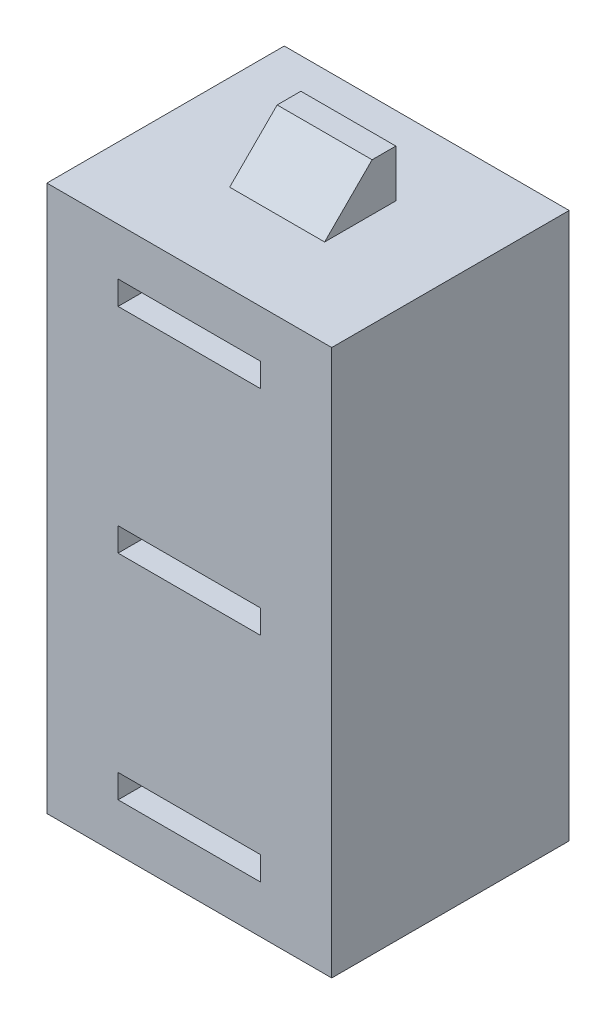
ISO-10303-21;
HEADER;
FILE_DESCRIPTION(('STEP AP214'),'2;1');
FILE_NAME('part.step','',(''),(''),'','','');
FILE_SCHEMA(('AUTOMOTIVE_DESIGN { 1 0 10303 214 1 1 1 1 }'));
ENDSEC;
DATA;
#1=APPLICATION_CONTEXT('core data for automotive mechanical design processes');
#2=APPLICATION_PROTOCOL_DEFINITION('international standard','automotive_design',2000,#1);
#3=PRODUCT_CONTEXT('',#1,'mechanical');
#4=PRODUCT('Part','Part','',(#3));
#5=PRODUCT_RELATED_PRODUCT_CATEGORY('part','',(#4));
#6=PRODUCT_DEFINITION_FORMATION('','',#4);
#7=PRODUCT_DEFINITION_CONTEXT('part definition',#1,'design');
#8=PRODUCT_DEFINITION('design','',#6,#7);
#9=PRODUCT_DEFINITION_SHAPE('','',#8);
#10=(LENGTH_UNIT() NAMED_UNIT(*) SI_UNIT(.MILLI.,.METRE.));
#11=(NAMED_UNIT(*) PLANE_ANGLE_UNIT() SI_UNIT($,.RADIAN.));
#12=(NAMED_UNIT(*) SI_UNIT($,.STERADIAN.) SOLID_ANGLE_UNIT());
#13=UNCERTAINTY_MEASURE_WITH_UNIT(LENGTH_MEASURE(1.E-05),#10,'distance_accuracy_value','');
#14=(GEOMETRIC_REPRESENTATION_CONTEXT(3) GLOBAL_UNCERTAINTY_ASSIGNED_CONTEXT((#13)) GLOBAL_UNIT_ASSIGNED_CONTEXT((#10,
#11,#12)) REPRESENTATION_CONTEXT('',''));
#15=CARTESIAN_POINT('',(0.,0.,0.));
#16=DIRECTION('',(0.,0.,1.));
#17=DIRECTION('',(1.,0.,0.));
#18=AXIS2_PLACEMENT_3D('',#15,#16,#17);
#19=CARTESIAN_POINT('',(0.,0.,-20.5));
#20=DIRECTION('',(0.,0.,1.));
#21=DIRECTION('',(1.,0.,0.));
#22=AXIS2_PLACEMENT_3D('',#19,#20,#21);
#23=PLANE('',#22);
#24=DIRECTION('',(0.,1.,0.));
#25=VECTOR('',#24,1.);
#26=CARTESIAN_POINT('',(-1.5,2.375,-20.5));
#27=LINE('',#26,#25);
#28=CARTESIAN_POINT('',(-1.5,4.25,-20.5));
#29=VERTEX_POINT('',#28);
#30=CARTESIAN_POINT('',(-1.5,4.75,-20.5));
#31=VERTEX_POINT('',#30);
#32=EDGE_CURVE('E284',#29,#31,#27,.T.);
#33=ORIENTED_EDGE('',*,*,#32,.T.);
#34=DIRECTION('',(1.,0.,0.));
#35=VECTOR('',#34,1.);
#36=CARTESIAN_POINT('',(0.74999999999999,4.75,-20.5));
#37=LINE('',#36,#35);
#38=CARTESIAN_POINT('',(1.5,4.75,-20.5));
#39=VERTEX_POINT('',#38);
#40=EDGE_CURVE('E416',#31,#39,#37,.T.);
#41=ORIENTED_EDGE('',*,*,#40,.T.);
#42=DIRECTION('',(0.,-1.,0.));
#43=VECTOR('',#42,1.);
#44=CARTESIAN_POINT('',(1.5,2.125,-20.5));
#45=LINE('',#44,#43);
#46=CARTESIAN_POINT('',(1.5,4.25,-20.5));
#47=VERTEX_POINT('',#46);
#48=EDGE_CURVE('E382',#39,#47,#45,.T.);
#49=ORIENTED_EDGE('',*,*,#48,.T.);
#50=DIRECTION('',(-1.,0.,0.));
#51=VECTOR('',#50,1.);
#52=CARTESIAN_POINT('',(-0.750000000000011,4.25,-20.5));
#53=LINE('',#52,#51);
#54=EDGE_CURVE('E327',#47,#29,#53,.T.);
#55=ORIENTED_EDGE('',*,*,#54,.T.);
#56=EDGE_LOOP('',(#33,#41,#49,#55));
#57=FACE_BOUND('',#56,.T.);
#58=DIRECTION('',(0.,1.,0.));
#59=VECTOR('',#58,1.);
#60=CARTESIAN_POINT('',(-1.5,0.125,-20.5));
#61=LINE('',#60,#59);
#62=CARTESIAN_POINT('',(-1.5,-0.25,-20.5));
#63=VERTEX_POINT('',#62);
#64=CARTESIAN_POINT('',(-1.5,0.25,-20.5));
#65=VERTEX_POINT('',#64);
#66=EDGE_CURVE('E348',#63,#65,#61,.T.);
#67=ORIENTED_EDGE('',*,*,#66,.T.);
#68=DIRECTION('',(1.,0.,0.));
#69=VECTOR('',#68,1.);
#70=CARTESIAN_POINT('',(0.74999999999999,0.25,-20.5));
#71=LINE('',#70,#69);
#72=CARTESIAN_POINT('',(1.5,0.25,-20.5));
#73=VERTEX_POINT('',#72);
#74=EDGE_CURVE('E264',#65,#73,#71,.T.);
#75=ORIENTED_EDGE('',*,*,#74,.T.);
#76=DIRECTION('',(0.,-1.,0.));
#77=VECTOR('',#76,1.);
#78=CARTESIAN_POINT('',(1.5,-0.125,-20.5));
#79=LINE('',#78,#77);
#80=CARTESIAN_POINT('',(1.5,-0.25,-20.5));
#81=VERTEX_POINT('',#80);
#82=EDGE_CURVE('E276',#73,#81,#79,.T.);
#83=ORIENTED_EDGE('',*,*,#82,.T.);
#84=DIRECTION('',(-1.,0.,0.));
#85=VECTOR('',#84,1.);
#86=CARTESIAN_POINT('',(-0.750000000000011,-0.25,-20.5));
#87=LINE('',#86,#85);
#88=EDGE_CURVE('E336',#81,#63,#87,.T.);
#89=ORIENTED_EDGE('',*,*,#88,.T.);
#90=EDGE_LOOP('',(#67,#75,#83,#89));
#91=FACE_BOUND('',#90,.T.);
#92=DIRECTION('',(0.,1.,0.));
#93=VECTOR('',#92,1.);
#94=CARTESIAN_POINT('',(-1.5,-2.125,-20.5));
#95=LINE('',#94,#93);
#96=CARTESIAN_POINT('',(-1.5,-4.75,-20.5));
#97=VERTEX_POINT('',#96);
#98=CARTESIAN_POINT('',(-1.5,-4.25,-20.5));
#99=VERTEX_POINT('',#98);
#100=EDGE_CURVE('E326',#97,#99,#95,.T.);
#101=ORIENTED_EDGE('',*,*,#100,.T.);
#102=DIRECTION('',(1.,0.,0.));
#103=VECTOR('',#102,1.);
#104=CARTESIAN_POINT('',(0.74999999999999,-4.25,-20.5));
#105=LINE('',#104,#103);
#106=CARTESIAN_POINT('',(1.5,-4.25,-20.5));
#107=VERTEX_POINT('',#106);
#108=EDGE_CURVE('E266',#99,#107,#105,.T.);
#109=ORIENTED_EDGE('',*,*,#108,.T.);
#110=DIRECTION('',(0.,-1.,0.));
#111=VECTOR('',#110,1.);
#112=CARTESIAN_POINT('',(1.5,-2.375,-20.5));
#113=LINE('',#112,#111);
#114=CARTESIAN_POINT('',(1.5,-4.75,-20.5));
#115=VERTEX_POINT('',#114);
#116=EDGE_CURVE('E401',#107,#115,#113,.T.);
#117=ORIENTED_EDGE('',*,*,#116,.T.);
#118=DIRECTION('',(-1.,0.,0.));
#119=VECTOR('',#118,1.);
#120=CARTESIAN_POINT('',(-0.750000000000011,-4.75,-20.5));
#121=LINE('',#120,#119);
#122=EDGE_CURVE('E292',#115,#97,#121,.T.);
#123=ORIENTED_EDGE('',*,*,#122,.T.);
#124=EDGE_LOOP('',(#101,#109,#117,#123));
#125=FACE_BOUND('',#124,.T.);
#126=DIRECTION('',(-1.,0.,0.));
#127=VECTOR('',#126,1.);
#128=CARTESIAN_POINT('',(3.,5.75,-20.5));
#129=LINE('',#128,#127);
#130=CARTESIAN_POINT('',(3.,5.75,-20.5));
#131=VERTEX_POINT('',#130);
#132=CARTESIAN_POINT('',(-3.,5.75,-20.5));
#133=VERTEX_POINT('',#132);
#134=EDGE_CURVE('E11',#131,#133,#129,.T.);
#135=ORIENTED_EDGE('',*,*,#134,.T.);
#136=DIRECTION('',(0.,-1.,0.));
#137=VECTOR('',#136,1.);
#138=CARTESIAN_POINT('',(-3.,5.75,-20.5));
#139=LINE('',#138,#137);
#140=CARTESIAN_POINT('',(-3.,-5.75,-20.5));
#141=VERTEX_POINT('',#140);
#142=EDGE_CURVE('E198',#133,#141,#139,.T.);
#143=ORIENTED_EDGE('',*,*,#142,.T.);
#144=DIRECTION('',(1.,0.,0.));
#145=VECTOR('',#144,1.);
#146=CARTESIAN_POINT('',(-3.,-5.75,-20.5));
#147=LINE('',#146,#145);
#148=CARTESIAN_POINT('',(3.,-5.75,-20.5));
#149=VERTEX_POINT('',#148);
#150=EDGE_CURVE('E192',#141,#149,#147,.T.);
#151=ORIENTED_EDGE('',*,*,#150,.T.);
#152=DIRECTION('',(0.,1.,0.));
#153=VECTOR('',#152,1.);
#154=CARTESIAN_POINT('',(3.,-5.75,-20.5));
#155=LINE('',#154,#153);
#156=EDGE_CURVE('E195',#149,#131,#155,.T.);
#157=ORIENTED_EDGE('',*,*,#156,.T.);
#158=EDGE_LOOP('',(#135,#143,#151,#157));
#159=FACE_BOUND('',#158,.T.);
#160=ADVANCED_FACE('F17',(#57,#91,#125,#159),#23,.T.);
#161=CARTESIAN_POINT('',(0.,0.,-25.5));
#162=DIRECTION('',(0.,0.,-1.));
#163=DIRECTION('',(-1.,0.,0.));
#164=AXIS2_PLACEMENT_3D('',#161,#162,#163);
#165=PLANE('',#164);
#166=DIRECTION('',(0.,-1.,0.));
#167=VECTOR('',#166,1.);
#168=CARTESIAN_POINT('',(-1.5,2.375,-25.5));
#169=LINE('',#168,#167);
#170=CARTESIAN_POINT('',(-1.5,4.75,-25.5));
#171=VERTEX_POINT('',#170);
#172=CARTESIAN_POINT('',(-1.5,4.25,-25.5));
#173=VERTEX_POINT('',#172);
#174=EDGE_CURVE('E288',#171,#173,#169,.T.);
#175=ORIENTED_EDGE('',*,*,#174,.T.);
#176=DIRECTION('',(1.,0.,0.));
#177=VECTOR('',#176,1.);
#178=CARTESIAN_POINT('',(-0.750000000000013,4.25,-25.5));
#179=LINE('',#178,#177);
#180=CARTESIAN_POINT('',(1.5,4.25,-25.5));
#181=VERTEX_POINT('',#180);
#182=EDGE_CURVE('E330',#173,#181,#179,.T.);
#183=ORIENTED_EDGE('',*,*,#182,.T.);
#184=DIRECTION('',(0.,1.,0.));
#185=VECTOR('',#184,1.);
#186=CARTESIAN_POINT('',(1.5,2.125,-25.5));
#187=LINE('',#186,#185);
#188=CARTESIAN_POINT('',(1.5,4.75,-25.5));
#189=VERTEX_POINT('',#188);
#190=EDGE_CURVE('E381',#181,#189,#187,.T.);
#191=ORIENTED_EDGE('',*,*,#190,.T.);
#192=DIRECTION('',(-1.,0.,0.));
#193=VECTOR('',#192,1.);
#194=CARTESIAN_POINT('',(0.749999999999988,4.75,-25.5));
#195=LINE('',#194,#193);
#196=EDGE_CURVE('E413',#189,#171,#195,.T.);
#197=ORIENTED_EDGE('',*,*,#196,.T.);
#198=EDGE_LOOP('',(#175,#183,#191,#197));
#199=FACE_BOUND('',#198,.T.);
#200=DIRECTION('',(0.,-1.,0.));
#201=VECTOR('',#200,1.);
#202=CARTESIAN_POINT('',(-1.5,0.125,-25.5));
#203=LINE('',#202,#201);
#204=CARTESIAN_POINT('',(-1.5,0.25,-25.5));
#205=VERTEX_POINT('',#204);
#206=CARTESIAN_POINT('',(-1.5,-0.25,-25.5));
#207=VERTEX_POINT('',#206);
#208=EDGE_CURVE('E265',#205,#207,#203,.T.);
#209=ORIENTED_EDGE('',*,*,#208,.T.);
#210=DIRECTION('',(1.,0.,0.));
#211=VECTOR('',#210,1.);
#212=CARTESIAN_POINT('',(-0.750000000000013,-0.25,-25.5));
#213=LINE('',#212,#211);
#214=CARTESIAN_POINT('',(1.5,-0.25,-25.5));
#215=VERTEX_POINT('',#214);
#216=EDGE_CURVE('E409',#207,#215,#213,.T.);
#217=ORIENTED_EDGE('',*,*,#216,.T.);
#218=DIRECTION('',(0.,1.,0.));
#219=VECTOR('',#218,1.);
#220=CARTESIAN_POINT('',(1.5,-0.125,-25.5));
#221=LINE('',#220,#219);
#222=CARTESIAN_POINT('',(1.5,0.25,-25.5));
#223=VERTEX_POINT('',#222);
#224=EDGE_CURVE('E275',#215,#223,#221,.T.);
#225=ORIENTED_EDGE('',*,*,#224,.T.);
#226=DIRECTION('',(-1.,0.,0.));
#227=VECTOR('',#226,1.);
#228=CARTESIAN_POINT('',(0.749999999999988,0.25,-25.5));
#229=LINE('',#228,#227);
#230=EDGE_CURVE('E306',#223,#205,#229,.T.);
#231=ORIENTED_EDGE('',*,*,#230,.T.);
#232=EDGE_LOOP('',(#209,#217,#225,#231));
#233=FACE_BOUND('',#232,.T.);
#234=DIRECTION('',(0.,-1.,0.));
#235=VECTOR('',#234,1.);
#236=CARTESIAN_POINT('',(-1.5,-2.125,-25.5));
#237=LINE('',#236,#235);
#238=CARTESIAN_POINT('',(-1.5,-4.25,-25.5));
#239=VERTEX_POINT('',#238);
#240=CARTESIAN_POINT('',(-1.5,-4.75,-25.5));
#241=VERTEX_POINT('',#240);
#242=EDGE_CURVE('E322',#239,#241,#237,.T.);
#243=ORIENTED_EDGE('',*,*,#242,.T.);
#244=DIRECTION('',(1.,0.,0.));
#245=VECTOR('',#244,1.);
#246=CARTESIAN_POINT('',(-0.750000000000013,-4.75,-25.5));
#247=LINE('',#246,#245);
#248=CARTESIAN_POINT('',(1.5,-4.75,-25.5));
#249=VERTEX_POINT('',#248);
#250=EDGE_CURVE('E296',#241,#249,#247,.T.);
#251=ORIENTED_EDGE('',*,*,#250,.T.);
#252=DIRECTION('',(0.,1.,0.));
#253=VECTOR('',#252,1.);
#254=CARTESIAN_POINT('',(1.5,-2.375,-25.5));
#255=LINE('',#254,#253);
#256=CARTESIAN_POINT('',(1.5,-4.25,-25.5));
#257=VERTEX_POINT('',#256);
#258=EDGE_CURVE('E310',#249,#257,#255,.T.);
#259=ORIENTED_EDGE('',*,*,#258,.T.);
#260=DIRECTION('',(-1.,0.,0.));
#261=VECTOR('',#260,1.);
#262=CARTESIAN_POINT('',(0.749999999999987,-4.25,-25.5));
#263=LINE('',#262,#261);
#264=EDGE_CURVE('E269',#257,#239,#263,.T.);
#265=ORIENTED_EDGE('',*,*,#264,.T.);
#266=EDGE_LOOP('',(#243,#251,#259,#265));
#267=FACE_BOUND('',#266,.T.);
#268=DIRECTION('',(-1.,0.,0.));
#269=VECTOR('',#268,1.);
#270=CARTESIAN_POINT('',(3.,5.75,-25.5));
#271=LINE('',#270,#269);
#272=CARTESIAN_POINT('',(3.,5.75,-25.5));
#273=VERTEX_POINT('',#272);
#274=CARTESIAN_POINT('',(-3.,5.75,-25.5));
#275=VERTEX_POINT('',#274);
#276=EDGE_CURVE('E28',#273,#275,#271,.T.);
#277=ORIENTED_EDGE('',*,*,#276,.F.);
#278=DIRECTION('',(0.,1.,0.));
#279=VECTOR('',#278,1.);
#280=CARTESIAN_POINT('',(3.,-5.75,-25.5));
#281=LINE('',#280,#279);
#282=CARTESIAN_POINT('',(3.,-5.75,-25.5));
#283=VERTEX_POINT('',#282);
#284=EDGE_CURVE('E224',#283,#273,#281,.T.);
#285=ORIENTED_EDGE('',*,*,#284,.F.);
#286=DIRECTION('',(1.,0.,0.));
#287=VECTOR('',#286,1.);
#288=CARTESIAN_POINT('',(-3.,-5.75,-25.5));
#289=LINE('',#288,#287);
#290=CARTESIAN_POINT('',(-3.,-5.75,-25.5));
#291=VERTEX_POINT('',#290);
#292=EDGE_CURVE('E204',#291,#283,#289,.T.);
#293=ORIENTED_EDGE('',*,*,#292,.F.);
#294=DIRECTION('',(0.,-1.,0.));
#295=VECTOR('',#294,1.);
#296=CARTESIAN_POINT('',(-3.,5.75,-25.5));
#297=LINE('',#296,#295);
#298=EDGE_CURVE('E279',#275,#291,#297,.T.);
#299=ORIENTED_EDGE('',*,*,#298,.F.);
#300=EDGE_LOOP('',(#277,#285,#293,#299));
#301=FACE_BOUND('',#300,.T.);
#302=ADVANCED_FACE('F496',(#199,#233,#267,#301),#165,.T.);
#303=CARTESIAN_POINT('',(3.,5.75,-25.5));
#304=DIRECTION('',(0.,1.,0.));
#305=DIRECTION('',(1.,0.,0.));
#306=AXIS2_PLACEMENT_3D('',#303,#304,#305);
#307=PLANE('',#306);
#308=DIRECTION('',(0.,0.,-1.));
#309=VECTOR('',#308,1.);
#310=CARTESIAN_POINT('',(-1.,5.75,-24.3));
#311=LINE('',#310,#309);
#312=CARTESIAN_POINT('',(-1.,5.75,-22.35));
#313=VERTEX_POINT('',#312);
#314=CARTESIAN_POINT('',(-1.,5.75,-23.85));
#315=VERTEX_POINT('',#314);
#316=EDGE_CURVE('E464',#313,#315,#311,.T.);
#317=ORIENTED_EDGE('',*,*,#316,.T.);
#318=DIRECTION('',(1.,0.,0.));
#319=VECTOR('',#318,1.);
#320=CARTESIAN_POINT('',(1.5,5.75,-23.85));
#321=LINE('',#320,#319);
#322=CARTESIAN_POINT('',(1.,5.75,-23.85));
#323=VERTEX_POINT('',#322);
#324=EDGE_CURVE('E352',#315,#323,#321,.T.);
#325=ORIENTED_EDGE('',*,*,#324,.T.);
#326=DIRECTION('',(0.,0.,1.));
#327=VECTOR('',#326,1.);
#328=CARTESIAN_POINT('',(1.,5.75,-24.3));
#329=LINE('',#328,#327);
#330=CARTESIAN_POINT('',(1.,5.75,-22.35));
#331=VERTEX_POINT('',#330);
#332=EDGE_CURVE('E355',#323,#331,#329,.T.);
#333=ORIENTED_EDGE('',*,*,#332,.T.);
#334=DIRECTION('',(-1.,0.,0.));
#335=VECTOR('',#334,1.);
#336=CARTESIAN_POINT('',(1.5,5.75,-22.35));
#337=LINE('',#336,#335);
#338=EDGE_CURVE('E232',#331,#313,#337,.T.);
#339=ORIENTED_EDGE('',*,*,#338,.T.);
#340=EDGE_LOOP('',(#317,#325,#333,#339));
#341=FACE_BOUND('',#340,.T.);
#342=ORIENTED_EDGE('',*,*,#276,.T.);
#343=DIRECTION('',(0.,0.,1.));
#344=VECTOR('',#343,1.);
#345=CARTESIAN_POINT('',(-3.,5.75,-25.5));
#346=LINE('',#345,#344);
#347=EDGE_CURVE('E231',#275,#133,#346,.T.);
#348=ORIENTED_EDGE('',*,*,#347,.T.);
#349=ORIENTED_EDGE('',*,*,#134,.F.);
#350=DIRECTION('',(0.,0.,1.));
#351=VECTOR('',#350,1.);
#352=CARTESIAN_POINT('',(3.,5.75,-25.5));
#353=LINE('',#352,#351);
#354=EDGE_CURVE('E217',#273,#131,#353,.T.);
#355=ORIENTED_EDGE('',*,*,#354,.F.);
#356=EDGE_LOOP('',(#342,#348,#349,#355));
#357=FACE_BOUND('',#356,.T.);
#358=ADVANCED_FACE('F520',(#341,#357),#307,.T.);
#359=CARTESIAN_POINT('',(-3.,5.75,-25.5));
#360=DIRECTION('',(-1.,0.,0.));
#361=DIRECTION('',(0.,1.,0.));
#362=AXIS2_PLACEMENT_3D('',#359,#360,#361);
#363=PLANE('',#362);
#364=ORIENTED_EDGE('',*,*,#298,.T.);
#365=DIRECTION('',(0.,0.,1.));
#366=VECTOR('',#365,1.);
#367=CARTESIAN_POINT('',(-3.,-5.75,-25.5));
#368=LINE('',#367,#366);
#369=EDGE_CURVE('E203',#291,#141,#368,.T.);
#370=ORIENTED_EDGE('',*,*,#369,.T.);
#371=ORIENTED_EDGE('',*,*,#142,.F.);
#372=ORIENTED_EDGE('',*,*,#347,.F.);
#373=EDGE_LOOP('',(#364,#370,#371,#372));
#374=FACE_BOUND('',#373,.T.);
#375=ADVANCED_FACE('F923',(#374),#363,.T.);
#376=CARTESIAN_POINT('',(-3.,-5.75,-25.5));
#377=DIRECTION('',(0.,-1.,0.));
#378=DIRECTION('',(0.,0.,-1.));
#379=AXIS2_PLACEMENT_3D('',#376,#377,#378);
#380=PLANE('',#379);
#381=DIRECTION('',(0.,0.,1.));
#382=VECTOR('',#381,1.);
#383=CARTESIAN_POINT('',(-1.,-5.75,-24.3));
#384=LINE('',#383,#382);
#385=CARTESIAN_POINT('',(-1.,-5.75,-23.85));
#386=VERTEX_POINT('',#385);
#387=CARTESIAN_POINT('',(-1.,-5.75,-22.35));
#388=VERTEX_POINT('',#387);
#389=EDGE_CURVE('E387',#386,#388,#384,.T.);
#390=ORIENTED_EDGE('',*,*,#389,.T.);
#391=DIRECTION('',(1.,0.,0.));
#392=VECTOR('',#391,1.);
#393=CARTESIAN_POINT('',(-1.5,-5.75,-22.35));
#394=LINE('',#393,#392);
#395=CARTESIAN_POINT('',(1.,-5.75,-22.35));
#396=VERTEX_POINT('',#395);
#397=EDGE_CURVE('E315',#388,#396,#394,.T.);
#398=ORIENTED_EDGE('',*,*,#397,.T.);
#399=DIRECTION('',(0.,0.,-1.));
#400=VECTOR('',#399,1.);
#401=CARTESIAN_POINT('',(1.,-5.75,-24.3));
#402=LINE('',#401,#400);
#403=CARTESIAN_POINT('',(1.,-5.75,-23.85));
#404=VERTEX_POINT('',#403);
#405=EDGE_CURVE('E280',#396,#404,#402,.T.);
#406=ORIENTED_EDGE('',*,*,#405,.T.);
#407=DIRECTION('',(-1.,0.,0.));
#408=VECTOR('',#407,1.);
#409=CARTESIAN_POINT('',(-1.5,-5.75,-23.85));
#410=LINE('',#409,#408);
#411=EDGE_CURVE('E342',#404,#386,#410,.T.);
#412=ORIENTED_EDGE('',*,*,#411,.T.);
#413=EDGE_LOOP('',(#390,#398,#406,#412));
#414=FACE_BOUND('',#413,.T.);
#415=ORIENTED_EDGE('',*,*,#292,.T.);
#416=DIRECTION('',(0.,0.,1.));
#417=VECTOR('',#416,1.);
#418=CARTESIAN_POINT('',(3.,-5.75,-25.5));
#419=LINE('',#418,#417);
#420=EDGE_CURVE('E208',#283,#149,#419,.T.);
#421=ORIENTED_EDGE('',*,*,#420,.T.);
#422=ORIENTED_EDGE('',*,*,#150,.F.);
#423=ORIENTED_EDGE('',*,*,#369,.F.);
#424=EDGE_LOOP('',(#415,#421,#422,#423));
#425=FACE_BOUND('',#424,.T.);
#426=ADVANCED_FACE('F19',(#414,#425),#380,.T.);
#427=CARTESIAN_POINT('',(3.,-5.75,-25.5));
#428=DIRECTION('',(1.,0.,0.));
#429=DIRECTION('',(0.,0.,-1.));
#430=AXIS2_PLACEMENT_3D('',#427,#428,#429);
#431=PLANE('',#430);
#432=ORIENTED_EDGE('',*,*,#284,.T.);
#433=ORIENTED_EDGE('',*,*,#354,.T.);
#434=ORIENTED_EDGE('',*,*,#156,.F.);
#435=ORIENTED_EDGE('',*,*,#420,.F.);
#436=EDGE_LOOP('',(#432,#433,#434,#435));
#437=FACE_BOUND('',#436,.T.);
#438=ADVANCED_FACE('F215',(#437),#431,.T.);
#439=CARTESIAN_POINT('',(1.,-6.25,-23.1));
#440=DIRECTION('',(1.,0.,0.));
#441=DIRECTION('',(0.,1.,0.));
#442=AXIS2_PLACEMENT_3D('',#439,#440,#441);
#443=PLANE('',#442);
#444=DIRECTION('',(0.,0.707106781186549,0.707106781186546));
#445=VECTOR('',#444,1.);
#446=CARTESIAN_POINT('',(1.,-6.3125,-22.9125));
#447=LINE('',#446,#445);
#448=CARTESIAN_POINT('',(1.,-6.75,-23.35));
#449=VERTEX_POINT('',#448);
#450=EDGE_CURVE('E319',#449,#396,#447,.T.);
#451=ORIENTED_EDGE('',*,*,#450,.F.);
#452=DIRECTION('',(0.,0.,-1.));
#453=VECTOR('',#452,1.);
#454=CARTESIAN_POINT('',(1.,-6.75,-23.85));
#455=LINE('',#454,#453);
#456=CARTESIAN_POINT('',(1.,-6.75,-23.85));
#457=VERTEX_POINT('',#456);
#458=EDGE_CURVE('E383',#449,#457,#455,.T.);
#459=ORIENTED_EDGE('',*,*,#458,.T.);
#460=DIRECTION('',(0.,1.,0.));
#461=VECTOR('',#460,1.);
#462=CARTESIAN_POINT('',(1.,-5.75,-23.85));
#463=LINE('',#462,#461);
#464=EDGE_CURVE('E283',#457,#404,#463,.T.);
#465=ORIENTED_EDGE('',*,*,#464,.T.);
#466=ORIENTED_EDGE('',*,*,#405,.F.);
#467=EDGE_LOOP('',(#451,#459,#465,#466));
#468=FACE_BOUND('',#467,.T.);
#469=ADVANCED_FACE('F543',(#468),#443,.T.);
#470=CARTESIAN_POINT('',(0.,-6.75,-23.85));
#471=DIRECTION('',(0.,0.,-1.));
#472=DIRECTION('',(0.,-1.,0.));
#473=AXIS2_PLACEMENT_3D('',#470,#471,#472);
#474=PLANE('',#473);
#475=ORIENTED_EDGE('',*,*,#411,.F.);
#476=ORIENTED_EDGE('',*,*,#464,.F.);
#477=DIRECTION('',(1.,0.,0.));
#478=VECTOR('',#477,1.);
#479=CARTESIAN_POINT('',(0.,-6.75,-23.85));
#480=LINE('',#479,#478);
#481=CARTESIAN_POINT('',(-1.,-6.75,-23.85));
#482=VERTEX_POINT('',#481);
#483=EDGE_CURVE('E388',#482,#457,#480,.T.);
#484=ORIENTED_EDGE('',*,*,#483,.F.);
#485=DIRECTION('',(0.,-1.,0.));
#486=VECTOR('',#485,1.);
#487=CARTESIAN_POINT('',(-1.,-5.75,-23.85));
#488=LINE('',#487,#486);
#489=EDGE_CURVE('E21',#386,#482,#488,.T.);
#490=ORIENTED_EDGE('',*,*,#489,.F.);
#491=EDGE_LOOP('',(#475,#476,#484,#490));
#492=FACE_BOUND('',#491,.T.);
#493=ADVANCED_FACE('F539',(#492),#474,.T.);
#494=CARTESIAN_POINT('',(1.,6.25,-23.1));
#495=DIRECTION('',(1.,0.,0.));
#496=DIRECTION('',(0.,1.,0.));
#497=AXIS2_PLACEMENT_3D('',#494,#495,#496);
#498=PLANE('',#497);
#499=DIRECTION('',(0.,0.707106781186548,-0.707106781186548));
#500=VECTOR('',#499,1.);
#501=CARTESIAN_POINT('',(1.,6.3125,-22.9125));
#502=LINE('',#501,#500);
#503=CARTESIAN_POINT('',(1.,6.75,-23.35));
#504=VERTEX_POINT('',#503);
#505=EDGE_CURVE('E255',#331,#504,#502,.T.);
#506=ORIENTED_EDGE('',*,*,#505,.F.);
#507=ORIENTED_EDGE('',*,*,#332,.F.);
#508=DIRECTION('',(0.,1.,0.));
#509=VECTOR('',#508,1.);
#510=CARTESIAN_POINT('',(1.,5.75,-23.85));
#511=LINE('',#510,#509);
#512=CARTESIAN_POINT('',(1.,6.75,-23.85));
#513=VERTEX_POINT('',#512);
#514=EDGE_CURVE('E356',#323,#513,#511,.T.);
#515=ORIENTED_EDGE('',*,*,#514,.T.);
#516=DIRECTION('',(0.,0.,1.));
#517=VECTOR('',#516,1.);
#518=CARTESIAN_POINT('',(1.,6.75,-23.85));
#519=LINE('',#518,#517);
#520=EDGE_CURVE('E372',#513,#504,#519,.T.);
#521=ORIENTED_EDGE('',*,*,#520,.T.);
#522=EDGE_LOOP('',(#506,#507,#515,#521));
#523=FACE_BOUND('',#522,.T.);
#524=ADVANCED_FACE('F535',(#523),#498,.T.);
#525=CARTESIAN_POINT('',(0.,5.75,-23.85));
#526=DIRECTION('',(0.,0.,-1.));
#527=DIRECTION('',(0.,-1.,0.));
#528=AXIS2_PLACEMENT_3D('',#525,#526,#527);
#529=PLANE('',#528);
#530=DIRECTION('',(1.,0.,0.));
#531=VECTOR('',#530,1.);
#532=CARTESIAN_POINT('',(0.,6.75,-23.85));
#533=LINE('',#532,#531);
#534=CARTESIAN_POINT('',(-1.,6.75,-23.85));
#535=VERTEX_POINT('',#534);
#536=EDGE_CURVE('E364',#535,#513,#533,.T.);
#537=ORIENTED_EDGE('',*,*,#536,.T.);
#538=ORIENTED_EDGE('',*,*,#514,.F.);
#539=ORIENTED_EDGE('',*,*,#324,.F.);
#540=DIRECTION('',(0.,-1.,0.));
#541=VECTOR('',#540,1.);
#542=CARTESIAN_POINT('',(-1.,5.75,-23.85));
#543=LINE('',#542,#541);
#544=EDGE_CURVE('E227',#535,#315,#543,.T.);
#545=ORIENTED_EDGE('',*,*,#544,.F.);
#546=EDGE_LOOP('',(#537,#538,#539,#545));
#547=FACE_BOUND('',#546,.T.);
#548=ADVANCED_FACE('F538',(#547),#529,.T.);
#549=CARTESIAN_POINT('',(0.,6.75,-23.85));
#550=DIRECTION('',(0.,1.,0.));
#551=DIRECTION('',(1.,0.,0.));
#552=AXIS2_PLACEMENT_3D('',#549,#550,#551);
#553=PLANE('',#552);
#554=DIRECTION('',(-1.,0.,0.));
#555=VECTOR('',#554,1.);
#556=CARTESIAN_POINT('',(0.,6.75,-23.35));
#557=LINE('',#556,#555);
#558=CARTESIAN_POINT('',(-1.,6.75,-23.35));
#559=VERTEX_POINT('',#558);
#560=EDGE_CURVE('E247',#504,#559,#557,.T.);
#561=ORIENTED_EDGE('',*,*,#560,.F.);
#562=ORIENTED_EDGE('',*,*,#520,.F.);
#563=ORIENTED_EDGE('',*,*,#536,.F.);
#564=DIRECTION('',(0.,0.,-1.));
#565=VECTOR('',#564,1.);
#566=CARTESIAN_POINT('',(-1.,6.75,-23.85));
#567=LINE('',#566,#565);
#568=EDGE_CURVE('E235',#559,#535,#567,.T.);
#569=ORIENTED_EDGE('',*,*,#568,.F.);
#570=EDGE_LOOP('',(#561,#562,#563,#569));
#571=FACE_BOUND('',#570,.T.);
#572=ADVANCED_FACE('F533',(#571),#553,.T.);
#573=CARTESIAN_POINT('',(-1.,-6.25,-23.1));
#574=DIRECTION('',(-1.,0.,0.));
#575=DIRECTION('',(0.,0.,1.));
#576=AXIS2_PLACEMENT_3D('',#573,#574,#575);
#577=PLANE('',#576);
#578=DIRECTION('',(0.,-0.707106781186549,-0.707106781186546));
#579=VECTOR('',#578,1.);
#580=CARTESIAN_POINT('',(-1.,-6.3125,-22.9125));
#581=LINE('',#580,#579);
#582=CARTESIAN_POINT('',(-1.,-6.75,-23.35));
#583=VERTEX_POINT('',#582);
#584=EDGE_CURVE('E303',#388,#583,#581,.T.);
#585=ORIENTED_EDGE('',*,*,#584,.F.);
#586=ORIENTED_EDGE('',*,*,#389,.F.);
#587=ORIENTED_EDGE('',*,*,#489,.T.);
#588=DIRECTION('',(0.,0.,1.));
#589=VECTOR('',#588,1.);
#590=CARTESIAN_POINT('',(-1.,-6.75,-23.85));
#591=LINE('',#590,#589);
#592=EDGE_CURVE('E302',#482,#583,#591,.T.);
#593=ORIENTED_EDGE('',*,*,#592,.T.);
#594=EDGE_LOOP('',(#585,#586,#587,#593));
#595=FACE_BOUND('',#594,.T.);
#596=ADVANCED_FACE('F529',(#595),#577,.T.);
#597=CARTESIAN_POINT('',(0.,-6.75,-22.35));
#598=DIRECTION('',(0.,-1.,0.));
#599=DIRECTION('',(0.,0.,-1.));
#600=AXIS2_PLACEMENT_3D('',#597,#598,#599);
#601=PLANE('',#600);
#602=DIRECTION('',(1.,0.,0.));
#603=VECTOR('',#602,1.);
#604=CARTESIAN_POINT('',(0.,-6.75,-23.35));
#605=LINE('',#604,#603);
#606=EDGE_CURVE('E298',#583,#449,#605,.T.);
#607=ORIENTED_EDGE('',*,*,#606,.F.);
#608=ORIENTED_EDGE('',*,*,#592,.F.);
#609=ORIENTED_EDGE('',*,*,#483,.T.);
#610=ORIENTED_EDGE('',*,*,#458,.F.);
#611=EDGE_LOOP('',(#607,#608,#609,#610));
#612=FACE_BOUND('',#611,.T.);
#613=ADVANCED_FACE('F532',(#612),#601,.T.);
#614=CARTESIAN_POINT('',(0.,-6.25,-22.85));
#615=DIRECTION('',(0.,-0.707106781186546,0.707106781186549));
#616=DIRECTION('',(-1.,0.,0.));
#617=AXIS2_PLACEMENT_3D('',#614,#615,#616);
#618=PLANE('',#617);
#619=ORIENTED_EDGE('',*,*,#450,.T.);
#620=ORIENTED_EDGE('',*,*,#397,.F.);
#621=ORIENTED_EDGE('',*,*,#584,.T.);
#622=ORIENTED_EDGE('',*,*,#606,.T.);
#623=EDGE_LOOP('',(#619,#620,#621,#622));
#624=FACE_BOUND('',#623,.T.);
#625=ADVANCED_FACE('F837',(#624),#618,.T.);
#626=CARTESIAN_POINT('',(-1.,6.25,-23.1));
#627=DIRECTION('',(-1.,0.,0.));
#628=DIRECTION('',(0.,0.,1.));
#629=AXIS2_PLACEMENT_3D('',#626,#627,#628);
#630=PLANE('',#629);
#631=DIRECTION('',(0.,-0.707106781186548,0.707106781186548));
#632=VECTOR('',#631,1.);
#633=CARTESIAN_POINT('',(-1.,6.3125,-22.9125));
#634=LINE('',#633,#632);
#635=EDGE_CURVE('E236',#559,#313,#634,.T.);
#636=ORIENTED_EDGE('',*,*,#635,.F.);
#637=ORIENTED_EDGE('',*,*,#568,.T.);
#638=ORIENTED_EDGE('',*,*,#544,.T.);
#639=ORIENTED_EDGE('',*,*,#316,.F.);
#640=EDGE_LOOP('',(#636,#637,#638,#639));
#641=FACE_BOUND('',#640,.T.);
#642=ADVANCED_FACE('F555',(#641),#630,.T.);
#643=CARTESIAN_POINT('',(0.,6.25,-22.85));
#644=DIRECTION('',(0.,0.707106781186548,0.707106781186548));
#645=DIRECTION('',(1.,0.,0.));
#646=AXIS2_PLACEMENT_3D('',#643,#644,#645);
#647=PLANE('',#646);
#648=ORIENTED_EDGE('',*,*,#505,.T.);
#649=ORIENTED_EDGE('',*,*,#560,.T.);
#650=ORIENTED_EDGE('',*,*,#635,.T.);
#651=ORIENTED_EDGE('',*,*,#338,.F.);
#652=EDGE_LOOP('',(#648,#649,#650,#651));
#653=FACE_BOUND('',#652,.T.);
#654=ADVANCED_FACE('F550',(#653),#647,.T.);
#655=CARTESIAN_POINT('',(1.5,4.75,-25.5));
#656=DIRECTION('',(0.,1.,0.));
#657=DIRECTION('',(1.,0.,0.));
#658=AXIS2_PLACEMENT_3D('',#655,#656,#657);
#659=PLANE('',#658);
#660=ORIENTED_EDGE('',*,*,#40,.F.);
#661=DIRECTION('',(0.,0.,1.));
#662=VECTOR('',#661,1.);
#663=CARTESIAN_POINT('',(-1.5,4.75,-25.5));
#664=LINE('',#663,#662);
#665=EDGE_CURVE('E427',#171,#31,#664,.T.);
#666=ORIENTED_EDGE('',*,*,#665,.F.);
#667=ORIENTED_EDGE('',*,*,#196,.F.);
#668=DIRECTION('',(0.,0.,1.));
#669=VECTOR('',#668,1.);
#670=CARTESIAN_POINT('',(1.5,4.75,-25.5));
#671=LINE('',#670,#669);
#672=EDGE_CURVE('E377',#189,#39,#671,.T.);
#673=ORIENTED_EDGE('',*,*,#672,.T.);
#674=EDGE_LOOP('',(#660,#666,#667,#673));
#675=FACE_BOUND('',#674,.T.);
#676=ADVANCED_FACE('F498',(#675),#659,.F.);
#677=CARTESIAN_POINT('',(-1.5,4.75,-25.5));
#678=DIRECTION('',(-1.,0.,0.));
#679=DIRECTION('',(0.,1.,0.));
#680=AXIS2_PLACEMENT_3D('',#677,#678,#679);
#681=PLANE('',#680);
#682=ORIENTED_EDGE('',*,*,#32,.F.);
#683=DIRECTION('',(0.,0.,1.));
#684=VECTOR('',#683,1.);
#685=CARTESIAN_POINT('',(-1.5,4.25,-25.5));
#686=LINE('',#685,#684);
#687=EDGE_CURVE('E289',#173,#29,#686,.T.);
#688=ORIENTED_EDGE('',*,*,#687,.F.);
#689=ORIENTED_EDGE('',*,*,#174,.F.);
#690=ORIENTED_EDGE('',*,*,#665,.T.);
#691=EDGE_LOOP('',(#682,#688,#689,#690));
#692=FACE_BOUND('',#691,.T.);
#693=ADVANCED_FACE('F485',(#692),#681,.F.);
#694=CARTESIAN_POINT('',(-1.5,4.25,-25.5));
#695=DIRECTION('',(0.,-1.,0.));
#696=DIRECTION('',(0.,0.,-1.));
#697=AXIS2_PLACEMENT_3D('',#694,#695,#696);
#698=PLANE('',#697);
#699=ORIENTED_EDGE('',*,*,#54,.F.);
#700=DIRECTION('',(0.,0.,1.));
#701=VECTOR('',#700,1.);
#702=CARTESIAN_POINT('',(1.5,4.25,-25.5));
#703=LINE('',#702,#701);
#704=EDGE_CURVE('E331',#181,#47,#703,.T.);
#705=ORIENTED_EDGE('',*,*,#704,.F.);
#706=ORIENTED_EDGE('',*,*,#182,.F.);
#707=ORIENTED_EDGE('',*,*,#687,.T.);
#708=EDGE_LOOP('',(#699,#705,#706,#707));
#709=FACE_BOUND('',#708,.T.);
#710=ADVANCED_FACE('F494',(#709),#698,.F.);
#711=CARTESIAN_POINT('',(1.5,4.25,-25.5));
#712=DIRECTION('',(1.,0.,0.));
#713=DIRECTION('',(0.,0.,-1.));
#714=AXIS2_PLACEMENT_3D('',#711,#712,#713);
#715=PLANE('',#714);
#716=ORIENTED_EDGE('',*,*,#48,.F.);
#717=ORIENTED_EDGE('',*,*,#672,.F.);
#718=ORIENTED_EDGE('',*,*,#190,.F.);
#719=ORIENTED_EDGE('',*,*,#704,.T.);
#720=EDGE_LOOP('',(#716,#717,#718,#719));
#721=FACE_BOUND('',#720,.T.);
#722=ADVANCED_FACE('F501',(#721),#715,.F.);
#723=CARTESIAN_POINT('',(1.5,0.25,-25.5));
#724=DIRECTION('',(0.,1.,0.));
#725=DIRECTION('',(1.,0.,0.));
#726=AXIS2_PLACEMENT_3D('',#723,#724,#725);
#727=PLANE('',#726);
#728=ORIENTED_EDGE('',*,*,#74,.F.);
#729=DIRECTION('',(0.,0.,1.));
#730=VECTOR('',#729,1.);
#731=CARTESIAN_POINT('',(-1.5,0.25,-25.5));
#732=LINE('',#731,#730);
#733=EDGE_CURVE('E260',#205,#65,#732,.T.);
#734=ORIENTED_EDGE('',*,*,#733,.F.);
#735=ORIENTED_EDGE('',*,*,#230,.F.);
#736=DIRECTION('',(0.,0.,1.));
#737=VECTOR('',#736,1.);
#738=CARTESIAN_POINT('',(1.5,0.25,-25.5));
#739=LINE('',#738,#737);
#740=EDGE_CURVE('E271',#223,#73,#739,.T.);
#741=ORIENTED_EDGE('',*,*,#740,.T.);
#742=EDGE_LOOP('',(#728,#734,#735,#741));
#743=FACE_BOUND('',#742,.T.);
#744=ADVANCED_FACE('F503',(#743),#727,.F.);
#745=CARTESIAN_POINT('',(-1.5,0.25,-25.5));
#746=DIRECTION('',(-1.,0.,0.));
#747=DIRECTION('',(0.,1.,0.));
#748=AXIS2_PLACEMENT_3D('',#745,#746,#747);
#749=PLANE('',#748);
#750=ORIENTED_EDGE('',*,*,#66,.F.);
#751=DIRECTION('',(0.,0.,1.));
#752=VECTOR('',#751,1.);
#753=CARTESIAN_POINT('',(-1.5,-0.25,-25.5));
#754=LINE('',#753,#752);
#755=EDGE_CURVE('E351',#207,#63,#754,.T.);
#756=ORIENTED_EDGE('',*,*,#755,.F.);
#757=ORIENTED_EDGE('',*,*,#208,.F.);
#758=ORIENTED_EDGE('',*,*,#733,.T.);
#759=EDGE_LOOP('',(#750,#756,#757,#758));
#760=FACE_BOUND('',#759,.T.);
#761=ADVANCED_FACE('F510',(#760),#749,.F.);
#762=CARTESIAN_POINT('',(-1.5,-0.25,-25.5));
#763=DIRECTION('',(0.,-1.,0.));
#764=DIRECTION('',(0.,0.,-1.));
#765=AXIS2_PLACEMENT_3D('',#762,#763,#764);
#766=PLANE('',#765);
#767=ORIENTED_EDGE('',*,*,#88,.F.);
#768=DIRECTION('',(0.,0.,1.));
#769=VECTOR('',#768,1.);
#770=CARTESIAN_POINT('',(1.5,-0.25,-25.5));
#771=LINE('',#770,#769);
#772=EDGE_CURVE('E314',#215,#81,#771,.T.);
#773=ORIENTED_EDGE('',*,*,#772,.F.);
#774=ORIENTED_EDGE('',*,*,#216,.F.);
#775=ORIENTED_EDGE('',*,*,#755,.T.);
#776=EDGE_LOOP('',(#767,#773,#774,#775));
#777=FACE_BOUND('',#776,.T.);
#778=ADVANCED_FACE('F564',(#777),#766,.F.);
#779=CARTESIAN_POINT('',(1.5,-0.25,-25.5));
#780=DIRECTION('',(1.,0.,0.));
#781=DIRECTION('',(0.,0.,-1.));
#782=AXIS2_PLACEMENT_3D('',#779,#780,#781);
#783=PLANE('',#782);
#784=ORIENTED_EDGE('',*,*,#82,.F.);
#785=ORIENTED_EDGE('',*,*,#740,.F.);
#786=ORIENTED_EDGE('',*,*,#224,.F.);
#787=ORIENTED_EDGE('',*,*,#772,.T.);
#788=EDGE_LOOP('',(#784,#785,#786,#787));
#789=FACE_BOUND('',#788,.T.);
#790=ADVANCED_FACE('F561',(#789),#783,.F.);
#791=CARTESIAN_POINT('',(1.5,-4.25,-25.5));
#792=DIRECTION('',(0.,1.,0.));
#793=DIRECTION('',(1.,0.,0.));
#794=AXIS2_PLACEMENT_3D('',#791,#792,#793);
#795=PLANE('',#794);
#796=ORIENTED_EDGE('',*,*,#108,.F.);
#797=DIRECTION('',(0.,0.,1.));
#798=VECTOR('',#797,1.);
#799=CARTESIAN_POINT('',(-1.5,-4.25,-25.5));
#800=LINE('',#799,#798);
#801=EDGE_CURVE('E270',#239,#99,#800,.T.);
#802=ORIENTED_EDGE('',*,*,#801,.F.);
#803=ORIENTED_EDGE('',*,*,#264,.F.);
#804=DIRECTION('',(0.,0.,1.));
#805=VECTOR('',#804,1.);
#806=CARTESIAN_POINT('',(1.5,-4.25,-25.5));
#807=LINE('',#806,#805);
#808=EDGE_CURVE('E405',#257,#107,#807,.T.);
#809=ORIENTED_EDGE('',*,*,#808,.T.);
#810=EDGE_LOOP('',(#796,#802,#803,#809));
#811=FACE_BOUND('',#810,.T.);
#812=ADVANCED_FACE('F527',(#811),#795,.F.);
#813=CARTESIAN_POINT('',(-1.5,-4.25,-25.5));
#814=DIRECTION('',(-1.,0.,0.));
#815=DIRECTION('',(0.,0.,1.));
#816=AXIS2_PLACEMENT_3D('',#813,#814,#815);
#817=PLANE('',#816);
#818=ORIENTED_EDGE('',*,*,#100,.F.);
#819=DIRECTION('',(0.,0.,1.));
#820=VECTOR('',#819,1.);
#821=CARTESIAN_POINT('',(-1.5,-4.75,-25.5));
#822=LINE('',#821,#820);
#823=EDGE_CURVE('E411',#241,#97,#822,.T.);
#824=ORIENTED_EDGE('',*,*,#823,.F.);
#825=ORIENTED_EDGE('',*,*,#242,.F.);
#826=ORIENTED_EDGE('',*,*,#801,.T.);
#827=EDGE_LOOP('',(#818,#824,#825,#826));
#828=FACE_BOUND('',#827,.T.);
#829=ADVANCED_FACE('F523',(#828),#817,.F.);
#830=CARTESIAN_POINT('',(-1.5,-4.75,-25.5));
#831=DIRECTION('',(0.,-1.,0.));
#832=DIRECTION('',(0.,0.,-1.));
#833=AXIS2_PLACEMENT_3D('',#830,#831,#832);
#834=PLANE('',#833);
#835=ORIENTED_EDGE('',*,*,#122,.F.);
#836=DIRECTION('',(0.,0.,1.));
#837=VECTOR('',#836,1.);
#838=CARTESIAN_POINT('',(1.5,-4.75,-25.5));
#839=LINE('',#838,#837);
#840=EDGE_CURVE('E297',#249,#115,#839,.T.);
#841=ORIENTED_EDGE('',*,*,#840,.F.);
#842=ORIENTED_EDGE('',*,*,#250,.F.);
#843=ORIENTED_EDGE('',*,*,#823,.T.);
#844=EDGE_LOOP('',(#835,#841,#842,#843));
#845=FACE_BOUND('',#844,.T.);
#846=ADVANCED_FACE('F526',(#845),#834,.F.);
#847=CARTESIAN_POINT('',(1.5,-4.75,-25.5));
#848=DIRECTION('',(1.,0.,0.));
#849=DIRECTION('',(0.,0.,-1.));
#850=AXIS2_PLACEMENT_3D('',#847,#848,#849);
#851=PLANE('',#850);
#852=ORIENTED_EDGE('',*,*,#116,.F.);
#853=ORIENTED_EDGE('',*,*,#808,.F.);
#854=ORIENTED_EDGE('',*,*,#258,.F.);
#855=ORIENTED_EDGE('',*,*,#840,.T.);
#856=EDGE_LOOP('',(#852,#853,#854,#855));
#857=FACE_BOUND('',#856,.T.);
#858=ADVANCED_FACE('F568',(#857),#851,.F.);
#859=CLOSED_SHELL('',(#160,#302,#358,#375,#426,#438,#469,#493,#524,#548,#572,#596,#613,#625,
#642,#654,#676,#693,#710,#722,#744,#761,#778,#790,#812,#829,#846,#858));
#860=MANIFOLD_SOLID_BREP('B1',#859);
#861=ADVANCED_BREP_SHAPE_REPRESENTATION('',(#18,#860),#14);
#862=SHAPE_DEFINITION_REPRESENTATION(#9,#861);
ENDSEC;
END-ISO-10303-21;
